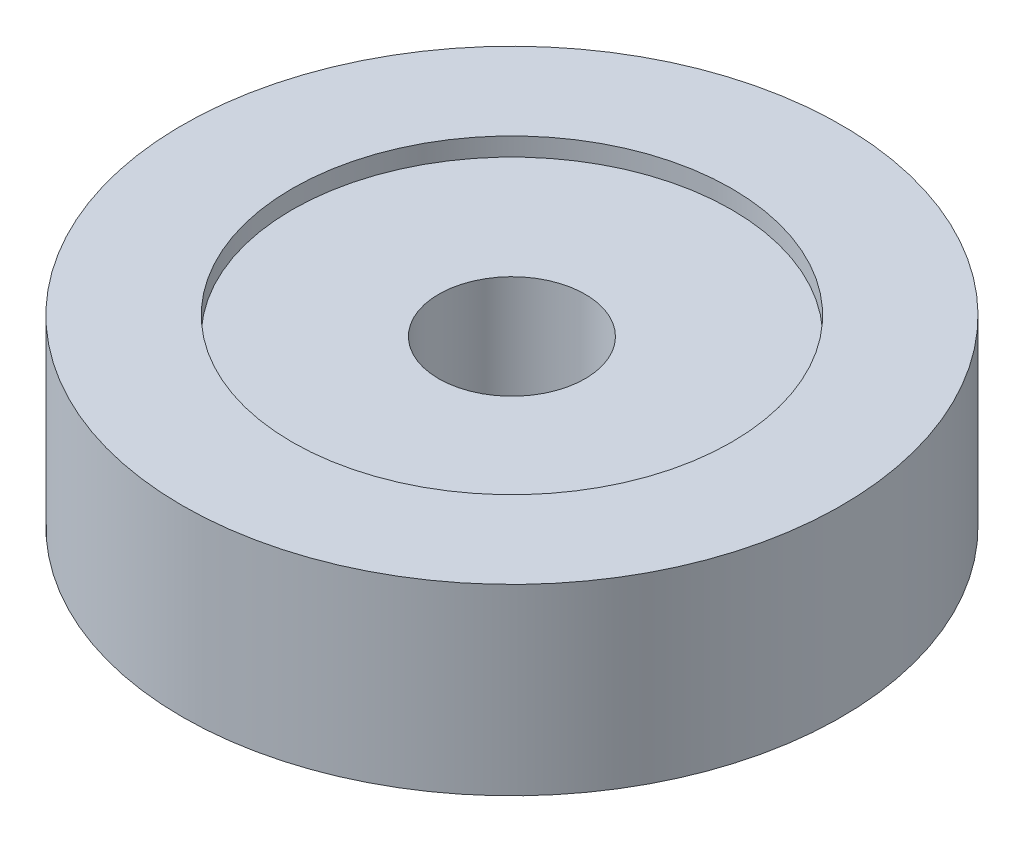
ISO-10303-21;
HEADER;
FILE_DESCRIPTION(('STEP AP214'),'2;1');
FILE_NAME('part.step','',(''),(''),'','','');
FILE_SCHEMA(('AUTOMOTIVE_DESIGN { 1 0 10303 214 1 1 1 1 }'));
ENDSEC;
DATA;
#1=APPLICATION_CONTEXT('core data for automotive mechanical design processes');
#2=APPLICATION_PROTOCOL_DEFINITION('international standard','automotive_design',2000,#1);
#3=PRODUCT_CONTEXT('',#1,'mechanical');
#4=PRODUCT('Part','Part','',(#3));
#5=PRODUCT_RELATED_PRODUCT_CATEGORY('part','',(#4));
#6=PRODUCT_DEFINITION_FORMATION('','',#4);
#7=PRODUCT_DEFINITION_CONTEXT('part definition',#1,'design');
#8=PRODUCT_DEFINITION('design','',#6,#7);
#9=PRODUCT_DEFINITION_SHAPE('','',#8);
#10=(LENGTH_UNIT() NAMED_UNIT(*) SI_UNIT(.MILLI.,.METRE.));
#11=(NAMED_UNIT(*) PLANE_ANGLE_UNIT() SI_UNIT($,.RADIAN.));
#12=(NAMED_UNIT(*) SI_UNIT($,.STERADIAN.) SOLID_ANGLE_UNIT());
#13=UNCERTAINTY_MEASURE_WITH_UNIT(LENGTH_MEASURE(1.E-05),#10,'distance_accuracy_value','');
#14=(GEOMETRIC_REPRESENTATION_CONTEXT(3) GLOBAL_UNCERTAINTY_ASSIGNED_CONTEXT((#13)) GLOBAL_UNIT_ASSIGNED_CONTEXT((#10,
#11,#12)) REPRESENTATION_CONTEXT('',''));
#15=CARTESIAN_POINT('',(0.,0.,0.));
#16=DIRECTION('',(0.,0.,1.));
#17=DIRECTION('',(1.,0.,0.));
#18=AXIS2_PLACEMENT_3D('',#15,#16,#17);
#19=CARTESIAN_POINT('',(0.,2.5,0.));
#20=DIRECTION('',(0.,1.,0.));
#21=DIRECTION('',(0.,0.,1.));
#22=AXIS2_PLACEMENT_3D('',#19,#20,#21);
#23=PLANE('',#22);
#24=CARTESIAN_POINT('',(0.,2.5,0.));
#25=DIRECTION('',(0.,1.,0.));
#26=DIRECTION('',(0.,0.,1.));
#27=AXIS2_PLACEMENT_3D('',#24,#25,#26);
#28=CIRCLE('',#27,9.);
#29=CARTESIAN_POINT('',(0.,2.5,9.));
#30=VERTEX_POINT('',#29);
#31=EDGE_CURVE('E11',#30,#30,#28,.T.);
#32=ORIENTED_EDGE('',*,*,#31,.T.);
#33=EDGE_LOOP('',(#32));
#34=FACE_BOUND('',#33,.T.);
#35=CARTESIAN_POINT('',(0.,2.5,0.));
#36=DIRECTION('',(0.,1.,0.));
#37=DIRECTION('',(0.,0.,1.));
#38=AXIS2_PLACEMENT_3D('',#35,#36,#37);
#39=CIRCLE('',#38,6.);
#40=CARTESIAN_POINT('',(0.,2.5,6.));
#41=VERTEX_POINT('',#40);
#42=EDGE_CURVE('E54',#41,#41,#39,.T.);
#43=ORIENTED_EDGE('',*,*,#42,.F.);
#44=EDGE_LOOP('',(#43));
#45=FACE_BOUND('',#44,.T.);
#46=ADVANCED_FACE('F43',(#34,#45),#23,.T.);
#47=CARTESIAN_POINT('',(0.,-2.5,0.));
#48=DIRECTION('',(0.,1.,0.));
#49=DIRECTION('',(0.,0.,1.));
#50=AXIS2_PLACEMENT_3D('',#47,#48,#49);
#51=PLANE('',#50);
#52=CARTESIAN_POINT('',(0.,-2.5,0.));
#53=DIRECTION('',(0.,1.,0.));
#54=DIRECTION('',(0.,0.,1.));
#55=AXIS2_PLACEMENT_3D('',#52,#53,#54);
#56=CIRCLE('',#55,9.);
#57=CARTESIAN_POINT('',(0.,-2.5,9.));
#58=VERTEX_POINT('',#57);
#59=EDGE_CURVE('E47',#58,#58,#56,.T.);
#60=ORIENTED_EDGE('',*,*,#59,.F.);
#61=EDGE_LOOP('',(#60));
#62=FACE_BOUND('',#61,.T.);
#63=CARTESIAN_POINT('',(0.,-2.5,0.));
#64=DIRECTION('',(0.,1.,0.));
#65=DIRECTION('',(0.,0.,1.));
#66=AXIS2_PLACEMENT_3D('',#63,#64,#65);
#67=CIRCLE('',#66,6.);
#68=CARTESIAN_POINT('',(0.,-2.5,6.));
#69=VERTEX_POINT('',#68);
#70=EDGE_CURVE('E56',#69,#69,#67,.T.);
#71=ORIENTED_EDGE('',*,*,#70,.T.);
#72=EDGE_LOOP('',(#71));
#73=FACE_BOUND('',#72,.T.);
#74=ADVANCED_FACE('F66',(#62,#73),#51,.F.);
#75=CARTESIAN_POINT('',(0.,2.5,0.));
#76=DIRECTION('',(0.,-1.,0.));
#77=DIRECTION('',(0.,0.,-1.));
#78=AXIS2_PLACEMENT_3D('',#75,#76,#77);
#79=CYLINDRICAL_SURFACE('',#78,9.);
#80=ORIENTED_EDGE('',*,*,#31,.F.);
#81=EDGE_LOOP('',(#80));
#82=FACE_BOUND('',#81,.T.);
#83=ORIENTED_EDGE('',*,*,#59,.T.);
#84=EDGE_LOOP('',(#83));
#85=FACE_BOUND('',#84,.T.);
#86=ADVANCED_FACE('F45',(#82,#85),#79,.T.);
#87=CARTESIAN_POINT('',(0.,2.5,0.));
#88=DIRECTION('',(0.,-1.,0.));
#89=DIRECTION('',(0.,0.,-1.));
#90=AXIS2_PLACEMENT_3D('',#87,#88,#89);
#91=CYLINDRICAL_SURFACE('',#90,6.);
#92=ORIENTED_EDGE('',*,*,#42,.T.);
#93=EDGE_LOOP('',(#92));
#94=FACE_BOUND('',#93,.T.);
#95=ORIENTED_EDGE('',*,*,#70,.F.);
#96=EDGE_LOOP('',(#95));
#97=FACE_BOUND('',#96,.T.);
#98=ADVANCED_FACE('F62',(#94,#97),#91,.F.);
#99=CLOSED_SHELL('',(#46,#74,#86,#98));
#100=MANIFOLD_SOLID_BREP('B2',#99);
#101=CARTESIAN_POINT('',(0.,2.,0.));
#102=DIRECTION('',(0.,1.,0.));
#103=DIRECTION('',(0.,0.,1.));
#104=AXIS2_PLACEMENT_3D('',#101,#102,#103);
#105=PLANE('',#104);
#106=CARTESIAN_POINT('',(0.,2.,0.));
#107=DIRECTION('',(0.,1.,0.));
#108=DIRECTION('',(0.,0.,1.));
#109=AXIS2_PLACEMENT_3D('',#106,#107,#108);
#110=CIRCLE('',#109,6.);
#111=CARTESIAN_POINT('',(0.,2.,6.));
#112=VERTEX_POINT('',#111);
#113=EDGE_CURVE('E42',#112,#112,#110,.T.);
#114=ORIENTED_EDGE('',*,*,#113,.T.);
#115=EDGE_LOOP('',(#114));
#116=FACE_BOUND('',#115,.T.);
#117=CARTESIAN_POINT('',(0.,2.,0.));
#118=DIRECTION('',(0.,1.,0.));
#119=DIRECTION('',(0.,0.,1.));
#120=AXIS2_PLACEMENT_3D('',#117,#118,#119);
#121=CIRCLE('',#120,2.);
#122=CARTESIAN_POINT('',(0.,2.,2.));
#123=VERTEX_POINT('',#122);
#124=EDGE_CURVE('E116',#123,#123,#121,.T.);
#125=ORIENTED_EDGE('',*,*,#124,.F.);
#126=EDGE_LOOP('',(#125));
#127=FACE_BOUND('',#126,.T.);
#128=ADVANCED_FACE('F105',(#116,#127),#105,.T.);
#129=CARTESIAN_POINT('',(0.,-2.,0.));
#130=DIRECTION('',(0.,1.,0.));
#131=DIRECTION('',(0.,0.,1.));
#132=AXIS2_PLACEMENT_3D('',#129,#130,#131);
#133=PLANE('',#132);
#134=CARTESIAN_POINT('',(0.,-2.,0.));
#135=DIRECTION('',(0.,1.,0.));
#136=DIRECTION('',(0.,0.,1.));
#137=AXIS2_PLACEMENT_3D('',#134,#135,#136);
#138=CIRCLE('',#137,6.);
#139=CARTESIAN_POINT('',(0.,-2.,6.));
#140=VERTEX_POINT('',#139);
#141=EDGE_CURVE('E109',#140,#140,#138,.T.);
#142=ORIENTED_EDGE('',*,*,#141,.F.);
#143=EDGE_LOOP('',(#142));
#144=FACE_BOUND('',#143,.T.);
#145=CARTESIAN_POINT('',(0.,-2.,0.));
#146=DIRECTION('',(0.,1.,0.));
#147=DIRECTION('',(0.,0.,1.));
#148=AXIS2_PLACEMENT_3D('',#145,#146,#147);
#149=CIRCLE('',#148,2.);
#150=CARTESIAN_POINT('',(0.,-2.,2.));
#151=VERTEX_POINT('',#150);
#152=EDGE_CURVE('E118',#151,#151,#149,.T.);
#153=ORIENTED_EDGE('',*,*,#152,.T.);
#154=EDGE_LOOP('',(#153));
#155=FACE_BOUND('',#154,.T.);
#156=ADVANCED_FACE('F128',(#144,#155),#133,.F.);
#157=CARTESIAN_POINT('',(0.,2.,0.));
#158=DIRECTION('',(0.,-1.,0.));
#159=DIRECTION('',(0.,0.,-1.));
#160=AXIS2_PLACEMENT_3D('',#157,#158,#159);
#161=CYLINDRICAL_SURFACE('',#160,6.);
#162=ORIENTED_EDGE('',*,*,#113,.F.);
#163=EDGE_LOOP('',(#162));
#164=FACE_BOUND('',#163,.T.);
#165=ORIENTED_EDGE('',*,*,#141,.T.);
#166=EDGE_LOOP('',(#165));
#167=FACE_BOUND('',#166,.T.);
#168=ADVANCED_FACE('F107',(#164,#167),#161,.T.);
#169=CARTESIAN_POINT('',(0.,2.,0.));
#170=DIRECTION('',(0.,-1.,0.));
#171=DIRECTION('',(0.,0.,-1.));
#172=AXIS2_PLACEMENT_3D('',#169,#170,#171);
#173=CYLINDRICAL_SURFACE('',#172,2.);
#174=ORIENTED_EDGE('',*,*,#124,.T.);
#175=EDGE_LOOP('',(#174));
#176=FACE_BOUND('',#175,.T.);
#177=ORIENTED_EDGE('',*,*,#152,.F.);
#178=EDGE_LOOP('',(#177));
#179=FACE_BOUND('',#178,.T.);
#180=ADVANCED_FACE('F124',(#176,#179),#173,.F.);
#181=CLOSED_SHELL('',(#128,#156,#168,#180));
#182=MANIFOLD_SOLID_BREP('B6',#181);
#183=ADVANCED_BREP_SHAPE_REPRESENTATION('',(#18,#100,#182),#14);
#184=SHAPE_DEFINITION_REPRESENTATION(#9,#183);
ENDSEC;
END-ISO-10303-21;
